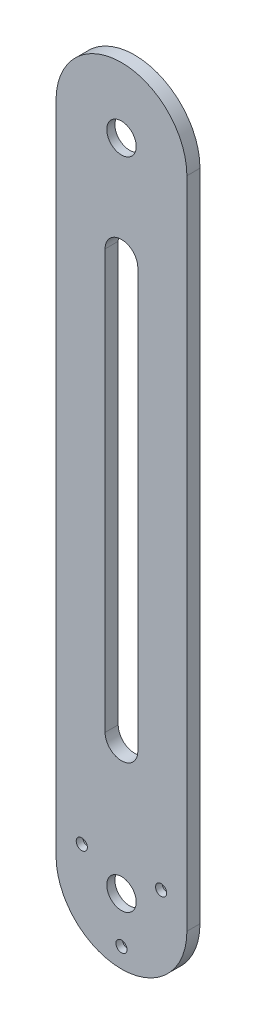
ISO-10303-21;
HEADER;
FILE_DESCRIPTION(('STEP AP214'),'2;1');
FILE_NAME('part.step','',(''),(''),'','','');
FILE_SCHEMA(('AUTOMOTIVE_DESIGN { 1 0 10303 214 1 1 1 1 }'));
ENDSEC;
DATA;
#1=APPLICATION_CONTEXT('core data for automotive mechanical design processes');
#2=APPLICATION_PROTOCOL_DEFINITION('international standard','automotive_design',2000,#1);
#3=PRODUCT_CONTEXT('',#1,'mechanical');
#4=PRODUCT('Part','Part','',(#3));
#5=PRODUCT_RELATED_PRODUCT_CATEGORY('part','',(#4));
#6=PRODUCT_DEFINITION_FORMATION('','',#4);
#7=PRODUCT_DEFINITION_CONTEXT('part definition',#1,'design');
#8=PRODUCT_DEFINITION('design','',#6,#7);
#9=PRODUCT_DEFINITION_SHAPE('','',#8);
#10=(LENGTH_UNIT() NAMED_UNIT(*) SI_UNIT(.MILLI.,.METRE.));
#11=(NAMED_UNIT(*) PLANE_ANGLE_UNIT() SI_UNIT($,.RADIAN.));
#12=(NAMED_UNIT(*) SI_UNIT($,.STERADIAN.) SOLID_ANGLE_UNIT());
#13=UNCERTAINTY_MEASURE_WITH_UNIT(LENGTH_MEASURE(1.E-05),#10,'distance_accuracy_value','');
#14=(GEOMETRIC_REPRESENTATION_CONTEXT(3) GLOBAL_UNCERTAINTY_ASSIGNED_CONTEXT((#13)) GLOBAL_UNIT_ASSIGNED_CONTEXT((#10,
#11,#12)) REPRESENTATION_CONTEXT('',''));
#15=CARTESIAN_POINT('',(0.,0.,0.));
#16=DIRECTION('',(0.,0.,1.));
#17=DIRECTION('',(1.,0.,0.));
#18=AXIS2_PLACEMENT_3D('',#15,#16,#17);
#19=CARTESIAN_POINT('',(-12.1243556529821,-193.,4.));
#20=DIRECTION('',(0.,0.,-1.));
#21=DIRECTION('',(-1.,0.,0.));
#22=AXIS2_PLACEMENT_3D('',#19,#20,#21);
#23=CYLINDRICAL_SURFACE('',#22,1.69999999999996);
#24=CARTESIAN_POINT('',(-12.1243556529821,-193.,4.));
#25=DIRECTION('',(0.,0.,-1.));
#26=DIRECTION('',(-1.,0.,0.));
#27=AXIS2_PLACEMENT_3D('',#24,#25,#26);
#28=CIRCLE('',#27,1.69999999999996);
#29=CARTESIAN_POINT('',(-13.824355652982,-193.,4.));
#30=VERTEX_POINT('',#29);
#31=EDGE_CURVE('E129',#30,#30,#28,.T.);
#32=ORIENTED_EDGE('',*,*,#31,.F.);
#33=EDGE_LOOP('',(#32));
#34=FACE_BOUND('',#33,.T.);
#35=CARTESIAN_POINT('',(-12.1243556529821,-193.,2.));
#36=DIRECTION('',(0.,0.,-1.));
#37=DIRECTION('',(-1.,0.,0.));
#38=AXIS2_PLACEMENT_3D('',#35,#36,#37);
#39=CIRCLE('',#38,1.69999999999996);
#40=CARTESIAN_POINT('',(-13.824355652982,-193.,2.));
#41=VERTEX_POINT('',#40);
#42=EDGE_CURVE('E42',#41,#41,#39,.F.);
#43=ORIENTED_EDGE('',*,*,#42,.F.);
#44=EDGE_LOOP('',(#43));
#45=FACE_BOUND('',#44,.T.);
#46=ADVANCED_FACE('F38',(#34,#45),#23,.F.);
#47=CARTESIAN_POINT('',(12.124355652982,-193.,4.));
#48=DIRECTION('',(0.,0.,-1.));
#49=DIRECTION('',(-1.,0.,0.));
#50=AXIS2_PLACEMENT_3D('',#47,#48,#49);
#51=CYLINDRICAL_SURFACE('',#50,1.69999999999973);
#52=CARTESIAN_POINT('',(12.124355652982,-193.,4.));
#53=DIRECTION('',(0.,0.,-1.));
#54=DIRECTION('',(-1.,0.,0.));
#55=AXIS2_PLACEMENT_3D('',#52,#53,#54);
#56=CIRCLE('',#55,1.69999999999973);
#57=CARTESIAN_POINT('',(10.4243556529823,-193.,4.));
#58=VERTEX_POINT('',#57);
#59=EDGE_CURVE('E206',#58,#58,#56,.T.);
#60=ORIENTED_EDGE('',*,*,#59,.F.);
#61=EDGE_LOOP('',(#60));
#62=FACE_BOUND('',#61,.T.);
#63=CARTESIAN_POINT('',(12.124355652982,-193.,2.));
#64=DIRECTION('',(0.,0.,-1.));
#65=DIRECTION('',(-1.,0.,0.));
#66=AXIS2_PLACEMENT_3D('',#63,#64,#65);
#67=CIRCLE('',#66,1.69999999999973);
#68=CARTESIAN_POINT('',(10.4243556529823,-193.,2.));
#69=VERTEX_POINT('',#68);
#70=EDGE_CURVE('E197',#69,#69,#67,.F.);
#71=ORIENTED_EDGE('',*,*,#70,.F.);
#72=EDGE_LOOP('',(#71));
#73=FACE_BOUND('',#72,.T.);
#74=ADVANCED_FACE('F265',(#62,#73),#51,.F.);
#75=CARTESIAN_POINT('',(0.,-214.,4.));
#76=DIRECTION('',(0.,0.,-1.));
#77=DIRECTION('',(-1.,0.,0.));
#78=AXIS2_PLACEMENT_3D('',#75,#76,#77);
#79=CYLINDRICAL_SURFACE('',#78,1.7);
#80=CARTESIAN_POINT('',(0.,-214.,4.));
#81=DIRECTION('',(0.,0.,-1.));
#82=DIRECTION('',(-1.,0.,0.));
#83=AXIS2_PLACEMENT_3D('',#80,#81,#82);
#84=CIRCLE('',#83,1.7);
#85=CARTESIAN_POINT('',(-1.69999999999997,-214.,4.));
#86=VERTEX_POINT('',#85);
#87=EDGE_CURVE('E136',#86,#86,#84,.T.);
#88=ORIENTED_EDGE('',*,*,#87,.F.);
#89=EDGE_LOOP('',(#88));
#90=FACE_BOUND('',#89,.T.);
#91=CARTESIAN_POINT('',(0.,-214.,2.));
#92=DIRECTION('',(0.,0.,-1.));
#93=DIRECTION('',(-1.,0.,0.));
#94=AXIS2_PLACEMENT_3D('',#91,#92,#93);
#95=CIRCLE('',#94,1.7);
#96=CARTESIAN_POINT('',(-1.69999999999997,-214.,2.));
#97=VERTEX_POINT('',#96);
#98=EDGE_CURVE('E195',#97,#97,#95,.F.);
#99=ORIENTED_EDGE('',*,*,#98,.F.);
#100=EDGE_LOOP('',(#99));
#101=FACE_BOUND('',#100,.T.);
#102=ADVANCED_FACE('F271',(#90,#101),#79,.F.);
#103=CARTESIAN_POINT('',(0.,-200.,4.));
#104=DIRECTION('',(0.,0.,-1.));
#105=DIRECTION('',(-1.,0.,0.));
#106=AXIS2_PLACEMENT_3D('',#103,#104,#105);
#107=CYLINDRICAL_SURFACE('',#106,8.75000000000004);
#108=CARTESIAN_POINT('',(0.,-200.,0.));
#109=DIRECTION('',(0.,0.,1.));
#110=DIRECTION('',(1.,0.,0.));
#111=AXIS2_PLACEMENT_3D('',#108,#109,#110);
#112=CIRCLE('',#111,8.75000000000004);
#113=CARTESIAN_POINT('',(8.75000000000006,-200.,0.));
#114=VERTEX_POINT('',#113);
#115=EDGE_CURVE('E163',#114,#114,#112,.T.);
#116=ORIENTED_EDGE('',*,*,#115,.F.);
#117=EDGE_LOOP('',(#116));
#118=FACE_BOUND('',#117,.T.);
#119=CARTESIAN_POINT('',(0.,-200.,1.5));
#120=DIRECTION('',(0.,0.,1.));
#121=DIRECTION('',(1.,0.,0.));
#122=AXIS2_PLACEMENT_3D('',#119,#120,#121);
#123=CIRCLE('',#122,8.75000000000004);
#124=CARTESIAN_POINT('',(8.75000000000006,-200.,1.5));
#125=VERTEX_POINT('',#124);
#126=EDGE_CURVE('E149',#125,#125,#123,.T.);
#127=ORIENTED_EDGE('',*,*,#126,.T.);
#128=EDGE_LOOP('',(#127));
#129=FACE_BOUND('',#128,.T.);
#130=ADVANCED_FACE('F304',(#118,#129),#107,.F.);
#131=CARTESIAN_POINT('',(0.,0.,4.));
#132=DIRECTION('',(0.,0.,-1.));
#133=DIRECTION('',(-1.,0.,0.));
#134=AXIS2_PLACEMENT_3D('',#131,#132,#133);
#135=CYLINDRICAL_SURFACE('',#134,8.75);
#136=CARTESIAN_POINT('',(0.,0.,0.));
#137=DIRECTION('',(0.,0.,1.));
#138=DIRECTION('',(1.,0.,0.));
#139=AXIS2_PLACEMENT_3D('',#136,#137,#138);
#140=CIRCLE('',#139,8.75);
#141=CARTESIAN_POINT('',(8.75,0.,0.));
#142=VERTEX_POINT('',#141);
#143=EDGE_CURVE('E166',#142,#142,#140,.T.);
#144=ORIENTED_EDGE('',*,*,#143,.F.);
#145=EDGE_LOOP('',(#144));
#146=FACE_BOUND('',#145,.T.);
#147=CARTESIAN_POINT('',(0.,0.,1.5));
#148=DIRECTION('',(0.,0.,1.));
#149=DIRECTION('',(1.,0.,0.));
#150=AXIS2_PLACEMENT_3D('',#147,#148,#149);
#151=CIRCLE('',#150,8.75);
#152=CARTESIAN_POINT('',(8.75,0.,1.5));
#153=VERTEX_POINT('',#152);
#154=EDGE_CURVE('E158',#153,#153,#151,.T.);
#155=ORIENTED_EDGE('',*,*,#154,.T.);
#156=EDGE_LOOP('',(#155));
#157=FACE_BOUND('',#156,.T.);
#158=ADVANCED_FACE('F307',(#146,#157),#135,.F.);
#159=CARTESIAN_POINT('',(0.,-200.,4.));
#160=DIRECTION('',(0.,0.,1.));
#161=DIRECTION('',(1.,0.,0.));
#162=AXIS2_PLACEMENT_3D('',#159,#160,#161);
#163=PLANE('',#162);
#164=ORIENTED_EDGE('',*,*,#87,.T.);
#165=EDGE_LOOP('',(#164));
#166=FACE_BOUND('',#165,.T.);
#167=ORIENTED_EDGE('',*,*,#59,.T.);
#168=EDGE_LOOP('',(#167));
#169=FACE_BOUND('',#168,.T.);
#170=ORIENTED_EDGE('',*,*,#31,.T.);
#171=EDGE_LOOP('',(#170));
#172=FACE_BOUND('',#171,.T.);
#173=CARTESIAN_POINT('',(0.,-31.8450046889655,4.));
#174=DIRECTION('',(0.,0.,1.));
#175=DIRECTION('',(-1.,0.,0.));
#176=AXIS2_PLACEMENT_3D('',#173,#174,#175);
#177=CIRCLE('',#176,5.00000000000001);
#178=CARTESIAN_POINT('',(5.00000000000002,-31.8450046889655,4.));
#179=VERTEX_POINT('',#178);
#180=CARTESIAN_POINT('',(-5.,-31.8450046889655,4.));
#181=VERTEX_POINT('',#180);
#182=EDGE_CURVE('E55',#179,#181,#177,.T.);
#183=ORIENTED_EDGE('',*,*,#182,.F.);
#184=DIRECTION('',(0.,1.,0.));
#185=VECTOR('',#184,1.);
#186=CARTESIAN_POINT('',(5.00000000000002,-159.845004688965,4.));
#187=LINE('',#186,#185);
#188=CARTESIAN_POINT('',(5.00000000000002,-159.845004688965,4.));
#189=VERTEX_POINT('',#188);
#190=EDGE_CURVE('E123',#189,#179,#187,.T.);
#191=ORIENTED_EDGE('',*,*,#190,.F.);
#192=CARTESIAN_POINT('',(0.,-159.845004688965,4.));
#193=DIRECTION('',(0.,0.,1.));
#194=DIRECTION('',(1.,0.,0.));
#195=AXIS2_PLACEMENT_3D('',#192,#193,#194);
#196=CIRCLE('',#195,5.);
#197=CARTESIAN_POINT('',(-4.99999999999998,-159.845004688965,4.));
#198=VERTEX_POINT('',#197);
#199=EDGE_CURVE('E126',#198,#189,#196,.T.);
#200=ORIENTED_EDGE('',*,*,#199,.F.);
#201=DIRECTION('',(0.,-1.,0.));
#202=VECTOR('',#201,1.);
#203=CARTESIAN_POINT('',(-5.,-31.8450046889655,4.));
#204=LINE('',#203,#202);
#205=EDGE_CURVE('E135',#181,#198,#204,.T.);
#206=ORIENTED_EDGE('',*,*,#205,.F.);
#207=EDGE_LOOP('',(#183,#191,#200,#206));
#208=FACE_BOUND('',#207,.T.);
#209=CARTESIAN_POINT('',(0.,-200.,4.));
#210=DIRECTION('',(0.,0.,1.));
#211=DIRECTION('',(1.,0.,0.));
#212=AXIS2_PLACEMENT_3D('',#209,#210,#211);
#213=CIRCLE('',#212,20.);
#214=CARTESIAN_POINT('',(-20.,-200.,4.));
#215=VERTEX_POINT('',#214);
#216=CARTESIAN_POINT('',(20.,-200.,4.));
#217=VERTEX_POINT('',#216);
#218=EDGE_CURVE('E170',#215,#217,#213,.T.);
#219=ORIENTED_EDGE('',*,*,#218,.T.);
#220=DIRECTION('',(0.,1.,0.));
#221=VECTOR('',#220,1.);
#222=CARTESIAN_POINT('',(20.,-200.,4.));
#223=LINE('',#222,#221);
#224=CARTESIAN_POINT('',(20.,0.,4.));
#225=VERTEX_POINT('',#224);
#226=EDGE_CURVE('E173',#217,#225,#223,.T.);
#227=ORIENTED_EDGE('',*,*,#226,.T.);
#228=CARTESIAN_POINT('',(0.,0.,4.));
#229=DIRECTION('',(0.,0.,1.));
#230=DIRECTION('',(1.,0.,0.));
#231=AXIS2_PLACEMENT_3D('',#228,#229,#230);
#232=CIRCLE('',#231,20.);
#233=CARTESIAN_POINT('',(-20.,0.,4.));
#234=VERTEX_POINT('',#233);
#235=EDGE_CURVE('E176',#225,#234,#232,.T.);
#236=ORIENTED_EDGE('',*,*,#235,.T.);
#237=DIRECTION('',(0.,-1.,0.));
#238=VECTOR('',#237,1.);
#239=CARTESIAN_POINT('',(-20.,0.,4.));
#240=LINE('',#239,#238);
#241=EDGE_CURVE('E178',#234,#215,#240,.T.);
#242=ORIENTED_EDGE('',*,*,#241,.T.);
#243=EDGE_LOOP('',(#219,#227,#236,#242));
#244=FACE_BOUND('',#243,.T.);
#245=CARTESIAN_POINT('',(0.,0.,4.));
#246=DIRECTION('',(0.,0.,1.));
#247=DIRECTION('',(1.,0.,0.));
#248=AXIS2_PLACEMENT_3D('',#245,#246,#247);
#249=CIRCLE('',#248,4.5);
#250=CARTESIAN_POINT('',(4.5,0.,4.));
#251=VERTEX_POINT('',#250);
#252=EDGE_CURVE('E154',#251,#251,#249,.T.);
#253=ORIENTED_EDGE('',*,*,#252,.F.);
#254=EDGE_LOOP('',(#253));
#255=FACE_BOUND('',#254,.T.);
#256=CARTESIAN_POINT('',(0.,-200.,4.));
#257=DIRECTION('',(0.,0.,1.));
#258=DIRECTION('',(1.,0.,0.));
#259=AXIS2_PLACEMENT_3D('',#256,#257,#258);
#260=CIRCLE('',#259,4.49999999999999);
#261=CARTESIAN_POINT('',(4.50000000000002,-200.,4.));
#262=VERTEX_POINT('',#261);
#263=EDGE_CURVE('E142',#262,#262,#260,.T.);
#264=ORIENTED_EDGE('',*,*,#263,.F.);
#265=EDGE_LOOP('',(#264));
#266=FACE_BOUND('',#265,.T.);
#267=ADVANCED_FACE('F244',(#166,#169,#172,#208,#244,#255,#266),#163,.T.);
#268=CARTESIAN_POINT('',(0.,-200.,0.));
#269=DIRECTION('',(0.,0.,1.));
#270=DIRECTION('',(1.,0.,0.));
#271=AXIS2_PLACEMENT_3D('',#268,#269,#270);
#272=PLANE('',#271);
#273=CARTESIAN_POINT('',(12.124355652982,-193.,0.));
#274=DIRECTION('',(0.,0.,-1.));
#275=DIRECTION('',(-1.,0.,0.));
#276=AXIS2_PLACEMENT_3D('',#273,#274,#275);
#277=CIRCLE('',#276,3.00000000000001);
#278=CARTESIAN_POINT('',(9.12435565298204,-193.,0.));
#279=VERTEX_POINT('',#278);
#280=EDGE_CURVE('E227',#279,#279,#277,.T.);
#281=ORIENTED_EDGE('',*,*,#280,.F.);
#282=EDGE_LOOP('',(#281));
#283=FACE_BOUND('',#282,.T.);
#284=CARTESIAN_POINT('',(-12.1243556529821,-193.,0.));
#285=DIRECTION('',(0.,0.,-1.));
#286=DIRECTION('',(-1.,0.,0.));
#287=AXIS2_PLACEMENT_3D('',#284,#285,#286);
#288=CIRCLE('',#287,3.);
#289=CARTESIAN_POINT('',(-15.1243556529821,-193.,0.));
#290=VERTEX_POINT('',#289);
#291=EDGE_CURVE('E221',#290,#290,#288,.T.);
#292=ORIENTED_EDGE('',*,*,#291,.F.);
#293=EDGE_LOOP('',(#292));
#294=FACE_BOUND('',#293,.T.);
#295=CARTESIAN_POINT('',(0.,-214.,0.));
#296=DIRECTION('',(0.,0.,-1.));
#297=DIRECTION('',(-1.,0.,0.));
#298=AXIS2_PLACEMENT_3D('',#295,#296,#297);
#299=CIRCLE('',#298,3.);
#300=CARTESIAN_POINT('',(-2.99999999999997,-214.,0.));
#301=VERTEX_POINT('',#300);
#302=EDGE_CURVE('E215',#301,#301,#299,.T.);
#303=ORIENTED_EDGE('',*,*,#302,.F.);
#304=EDGE_LOOP('',(#303));
#305=FACE_BOUND('',#304,.T.);
#306=DIRECTION('',(0.,1.,0.));
#307=VECTOR('',#306,1.);
#308=CARTESIAN_POINT('',(5.00000000000002,-159.845004688965,0.));
#309=LINE('',#308,#307);
#310=CARTESIAN_POINT('',(5.00000000000002,-159.845004688965,0.));
#311=VERTEX_POINT('',#310);
#312=CARTESIAN_POINT('',(5.00000000000002,-31.8450046889655,0.));
#313=VERTEX_POINT('',#312);
#314=EDGE_CURVE('E113',#311,#313,#309,.T.);
#315=ORIENTED_EDGE('',*,*,#314,.T.);
#316=CARTESIAN_POINT('',(0.,-31.8450046889655,0.));
#317=DIRECTION('',(0.,0.,1.));
#318=DIRECTION('',(-1.,0.,0.));
#319=AXIS2_PLACEMENT_3D('',#316,#317,#318);
#320=CIRCLE('',#319,5.00000000000001);
#321=CARTESIAN_POINT('',(-5.,-31.8450046889655,0.));
#322=VERTEX_POINT('',#321);
#323=EDGE_CURVE('E107',#313,#322,#320,.T.);
#324=ORIENTED_EDGE('',*,*,#323,.T.);
#325=DIRECTION('',(0.,-1.,0.));
#326=VECTOR('',#325,1.);
#327=CARTESIAN_POINT('',(-5.,-31.8450046889655,0.));
#328=LINE('',#327,#326);
#329=CARTESIAN_POINT('',(-4.99999999999998,-159.845004688965,0.));
#330=VERTEX_POINT('',#329);
#331=EDGE_CURVE('E116',#322,#330,#328,.T.);
#332=ORIENTED_EDGE('',*,*,#331,.T.);
#333=CARTESIAN_POINT('',(0.,-159.845004688965,0.));
#334=DIRECTION('',(0.,0.,1.));
#335=DIRECTION('',(1.,0.,0.));
#336=AXIS2_PLACEMENT_3D('',#333,#334,#335);
#337=CIRCLE('',#336,5.);
#338=EDGE_CURVE('E63',#330,#311,#337,.T.);
#339=ORIENTED_EDGE('',*,*,#338,.T.);
#340=EDGE_LOOP('',(#315,#324,#332,#339));
#341=FACE_BOUND('',#340,.T.);
#342=CARTESIAN_POINT('',(0.,-200.,0.));
#343=DIRECTION('',(0.,0.,1.));
#344=DIRECTION('',(1.,0.,0.));
#345=AXIS2_PLACEMENT_3D('',#342,#343,#344);
#346=CIRCLE('',#345,20.);
#347=CARTESIAN_POINT('',(-20.,-200.,0.));
#348=VERTEX_POINT('',#347);
#349=CARTESIAN_POINT('',(20.,-200.,0.));
#350=VERTEX_POINT('',#349);
#351=EDGE_CURVE('E169',#348,#350,#346,.T.);
#352=ORIENTED_EDGE('',*,*,#351,.F.);
#353=DIRECTION('',(0.,-1.,0.));
#354=VECTOR('',#353,1.);
#355=CARTESIAN_POINT('',(-20.,0.,0.));
#356=LINE('',#355,#354);
#357=CARTESIAN_POINT('',(-20.,0.,0.));
#358=VERTEX_POINT('',#357);
#359=EDGE_CURVE('E174',#358,#348,#356,.T.);
#360=ORIENTED_EDGE('',*,*,#359,.F.);
#361=CARTESIAN_POINT('',(0.,0.,0.));
#362=DIRECTION('',(0.,0.,1.));
#363=DIRECTION('',(1.,0.,0.));
#364=AXIS2_PLACEMENT_3D('',#361,#362,#363);
#365=CIRCLE('',#364,20.);
#366=CARTESIAN_POINT('',(20.,0.,0.));
#367=VERTEX_POINT('',#366);
#368=EDGE_CURVE('E185',#367,#358,#365,.T.);
#369=ORIENTED_EDGE('',*,*,#368,.F.);
#370=DIRECTION('',(0.,1.,0.));
#371=VECTOR('',#370,1.);
#372=CARTESIAN_POINT('',(20.,-200.,0.));
#373=LINE('',#372,#371);
#374=EDGE_CURVE('E183',#350,#367,#373,.T.);
#375=ORIENTED_EDGE('',*,*,#374,.F.);
#376=EDGE_LOOP('',(#352,#360,#369,#375));
#377=FACE_BOUND('',#376,.T.);
#378=ORIENTED_EDGE('',*,*,#143,.T.);
#379=EDGE_LOOP('',(#378));
#380=FACE_BOUND('',#379,.T.);
#381=ORIENTED_EDGE('',*,*,#115,.T.);
#382=EDGE_LOOP('',(#381));
#383=FACE_BOUND('',#382,.T.);
#384=ADVANCED_FACE('F120',(#283,#294,#305,#341,#377,#380,#383),#272,.F.);
#385=CARTESIAN_POINT('',(0.,-200.,4.));
#386=DIRECTION('',(0.,0.,-1.));
#387=DIRECTION('',(-1.,0.,0.));
#388=AXIS2_PLACEMENT_3D('',#385,#386,#387);
#389=CYLINDRICAL_SURFACE('',#388,20.);
#390=ORIENTED_EDGE('',*,*,#351,.T.);
#391=DIRECTION('',(0.,0.,-1.));
#392=VECTOR('',#391,1.);
#393=CARTESIAN_POINT('',(20.,-200.,4.));
#394=LINE('',#393,#392);
#395=EDGE_CURVE('E11',#217,#350,#394,.T.);
#396=ORIENTED_EDGE('',*,*,#395,.F.);
#397=ORIENTED_EDGE('',*,*,#218,.F.);
#398=DIRECTION('',(0.,0.,-1.));
#399=VECTOR('',#398,1.);
#400=CARTESIAN_POINT('',(-20.,-200.,4.));
#401=LINE('',#400,#399);
#402=EDGE_CURVE('E180',#215,#348,#401,.T.);
#403=ORIENTED_EDGE('',*,*,#402,.T.);
#404=EDGE_LOOP('',(#390,#396,#397,#403));
#405=FACE_BOUND('',#404,.T.);
#406=ADVANCED_FACE('F40',(#405),#389,.T.);
#407=CARTESIAN_POINT('',(20.,-200.,4.));
#408=DIRECTION('',(-1.,0.,0.));
#409=DIRECTION('',(0.,-1.,0.));
#410=AXIS2_PLACEMENT_3D('',#407,#408,#409);
#411=PLANE('',#410);
#412=ORIENTED_EDGE('',*,*,#374,.T.);
#413=DIRECTION('',(0.,0.,-1.));
#414=VECTOR('',#413,1.);
#415=CARTESIAN_POINT('',(20.,0.,4.));
#416=LINE('',#415,#414);
#417=EDGE_CURVE('E47',#225,#367,#416,.T.);
#418=ORIENTED_EDGE('',*,*,#417,.F.);
#419=ORIENTED_EDGE('',*,*,#226,.F.);
#420=ORIENTED_EDGE('',*,*,#395,.T.);
#421=EDGE_LOOP('',(#412,#418,#419,#420));
#422=FACE_BOUND('',#421,.T.);
#423=ADVANCED_FACE('F320',(#422),#411,.F.);
#424=CARTESIAN_POINT('',(0.,0.,4.));
#425=DIRECTION('',(0.,0.,-1.));
#426=DIRECTION('',(-1.,0.,0.));
#427=AXIS2_PLACEMENT_3D('',#424,#425,#426);
#428=CYLINDRICAL_SURFACE('',#427,20.);
#429=ORIENTED_EDGE('',*,*,#368,.T.);
#430=DIRECTION('',(0.,0.,-1.));
#431=VECTOR('',#430,1.);
#432=CARTESIAN_POINT('',(-20.,0.,4.));
#433=LINE('',#432,#431);
#434=EDGE_CURVE('E190',#234,#358,#433,.T.);
#435=ORIENTED_EDGE('',*,*,#434,.F.);
#436=ORIENTED_EDGE('',*,*,#235,.F.);
#437=ORIENTED_EDGE('',*,*,#417,.T.);
#438=EDGE_LOOP('',(#429,#435,#436,#437));
#439=FACE_BOUND('',#438,.T.);
#440=ADVANCED_FACE('F317',(#439),#428,.T.);
#441=CARTESIAN_POINT('',(-20.,0.,4.));
#442=DIRECTION('',(1.,0.,0.));
#443=DIRECTION('',(0.,1.,0.));
#444=AXIS2_PLACEMENT_3D('',#441,#442,#443);
#445=PLANE('',#444);
#446=ORIENTED_EDGE('',*,*,#359,.T.);
#447=ORIENTED_EDGE('',*,*,#402,.F.);
#448=ORIENTED_EDGE('',*,*,#241,.F.);
#449=ORIENTED_EDGE('',*,*,#434,.T.);
#450=EDGE_LOOP('',(#446,#447,#448,#449));
#451=FACE_BOUND('',#450,.T.);
#452=ADVANCED_FACE('F302',(#451),#445,.F.);
#453=CARTESIAN_POINT('',(0.,0.,1.5));
#454=DIRECTION('',(0.,0.,1.));
#455=DIRECTION('',(1.,0.,0.));
#456=AXIS2_PLACEMENT_3D('',#453,#454,#455);
#457=PLANE('',#456);
#458=CARTESIAN_POINT('',(0.,0.,1.5));
#459=DIRECTION('',(0.,0.,1.));
#460=DIRECTION('',(1.,0.,0.));
#461=AXIS2_PLACEMENT_3D('',#458,#459,#460);
#462=CIRCLE('',#461,4.5);
#463=CARTESIAN_POINT('',(4.5,0.,1.5));
#464=VERTEX_POINT('',#463);
#465=EDGE_CURVE('E155',#464,#464,#462,.T.);
#466=ORIENTED_EDGE('',*,*,#465,.T.);
#467=EDGE_LOOP('',(#466));
#468=FACE_BOUND('',#467,.T.);
#469=ORIENTED_EDGE('',*,*,#154,.F.);
#470=EDGE_LOOP('',(#469));
#471=FACE_BOUND('',#470,.T.);
#472=ADVANCED_FACE('F298',(#468,#471),#457,.F.);
#473=CARTESIAN_POINT('',(0.,0.,1.5));
#474=DIRECTION('',(0.,0.,1.));
#475=DIRECTION('',(1.,0.,0.));
#476=AXIS2_PLACEMENT_3D('',#473,#474,#475);
#477=CYLINDRICAL_SURFACE('',#476,4.5);
#478=ORIENTED_EDGE('',*,*,#465,.F.);
#479=EDGE_LOOP('',(#478));
#480=FACE_BOUND('',#479,.T.);
#481=ORIENTED_EDGE('',*,*,#252,.T.);
#482=EDGE_LOOP('',(#481));
#483=FACE_BOUND('',#482,.T.);
#484=ADVANCED_FACE('F294',(#480,#483),#477,.F.);
#485=CARTESIAN_POINT('',(0.,-200.,1.5));
#486=DIRECTION('',(0.,0.,1.));
#487=DIRECTION('',(1.,0.,0.));
#488=AXIS2_PLACEMENT_3D('',#485,#486,#487);
#489=PLANE('',#488);
#490=CARTESIAN_POINT('',(0.,-200.,1.5));
#491=DIRECTION('',(0.,0.,1.));
#492=DIRECTION('',(1.,0.,0.));
#493=AXIS2_PLACEMENT_3D('',#490,#491,#492);
#494=CIRCLE('',#493,4.49999999999999);
#495=CARTESIAN_POINT('',(4.50000000000002,-200.,1.5));
#496=VERTEX_POINT('',#495);
#497=EDGE_CURVE('E146',#496,#496,#494,.T.);
#498=ORIENTED_EDGE('',*,*,#497,.T.);
#499=EDGE_LOOP('',(#498));
#500=FACE_BOUND('',#499,.T.);
#501=ORIENTED_EDGE('',*,*,#126,.F.);
#502=EDGE_LOOP('',(#501));
#503=FACE_BOUND('',#502,.T.);
#504=ADVANCED_FACE('F290',(#500,#503),#489,.F.);
#505=CARTESIAN_POINT('',(0.,-200.,1.5));
#506=DIRECTION('',(0.,0.,1.));
#507=DIRECTION('',(1.,0.,0.));
#508=AXIS2_PLACEMENT_3D('',#505,#506,#507);
#509=CYLINDRICAL_SURFACE('',#508,4.49999999999999);
#510=ORIENTED_EDGE('',*,*,#497,.F.);
#511=EDGE_LOOP('',(#510));
#512=FACE_BOUND('',#511,.T.);
#513=ORIENTED_EDGE('',*,*,#263,.T.);
#514=EDGE_LOOP('',(#513));
#515=FACE_BOUND('',#514,.T.);
#516=ADVANCED_FACE('F287',(#512,#515),#509,.F.);
#517=CARTESIAN_POINT('',(0.,-31.8450046889655,0.));
#518=DIRECTION('',(0.,0.,1.));
#519=DIRECTION('',(1.,0.,0.));
#520=AXIS2_PLACEMENT_3D('',#517,#518,#519);
#521=CYLINDRICAL_SURFACE('',#520,5.00000000000001);
#522=ORIENTED_EDGE('',*,*,#182,.T.);
#523=DIRECTION('',(0.,0.,1.));
#524=VECTOR('',#523,1.);
#525=CARTESIAN_POINT('',(-5.,-31.8450046889655,0.));
#526=LINE('',#525,#524);
#527=EDGE_CURVE('E103',#322,#181,#526,.T.);
#528=ORIENTED_EDGE('',*,*,#527,.F.);
#529=ORIENTED_EDGE('',*,*,#323,.F.);
#530=DIRECTION('',(0.,0.,1.));
#531=VECTOR('',#530,1.);
#532=CARTESIAN_POINT('',(5.00000000000002,-31.8450046889655,0.));
#533=LINE('',#532,#531);
#534=EDGE_CURVE('E140',#313,#179,#533,.T.);
#535=ORIENTED_EDGE('',*,*,#534,.T.);
#536=EDGE_LOOP('',(#522,#528,#529,#535));
#537=FACE_BOUND('',#536,.T.);
#538=ADVANCED_FACE('F105',(#537),#521,.F.);
#539=CARTESIAN_POINT('',(5.00000000000002,-159.845004688965,0.));
#540=DIRECTION('',(1.,0.,0.));
#541=DIRECTION('',(0.,1.,0.));
#542=AXIS2_PLACEMENT_3D('',#539,#540,#541);
#543=PLANE('',#542);
#544=ORIENTED_EDGE('',*,*,#190,.T.);
#545=ORIENTED_EDGE('',*,*,#534,.F.);
#546=ORIENTED_EDGE('',*,*,#314,.F.);
#547=DIRECTION('',(0.,0.,1.));
#548=VECTOR('',#547,1.);
#549=CARTESIAN_POINT('',(5.00000000000002,-159.845004688965,0.));
#550=LINE('',#549,#548);
#551=EDGE_CURVE('E143',#311,#189,#550,.T.);
#552=ORIENTED_EDGE('',*,*,#551,.T.);
#553=EDGE_LOOP('',(#544,#545,#546,#552));
#554=FACE_BOUND('',#553,.T.);
#555=ADVANCED_FACE('F276',(#554),#543,.F.);
#556=CARTESIAN_POINT('',(0.,-159.845004688965,0.));
#557=DIRECTION('',(0.,0.,1.));
#558=DIRECTION('',(1.,0.,0.));
#559=AXIS2_PLACEMENT_3D('',#556,#557,#558);
#560=CYLINDRICAL_SURFACE('',#559,5.);
#561=ORIENTED_EDGE('',*,*,#199,.T.);
#562=ORIENTED_EDGE('',*,*,#551,.F.);
#563=ORIENTED_EDGE('',*,*,#338,.F.);
#564=DIRECTION('',(0.,0.,1.));
#565=VECTOR('',#564,1.);
#566=CARTESIAN_POINT('',(-4.99999999999998,-159.845004688965,0.));
#567=LINE('',#566,#565);
#568=EDGE_CURVE('E112',#330,#198,#567,.T.);
#569=ORIENTED_EDGE('',*,*,#568,.T.);
#570=EDGE_LOOP('',(#561,#562,#563,#569));
#571=FACE_BOUND('',#570,.T.);
#572=ADVANCED_FACE('F279',(#571),#560,.F.);
#573=CARTESIAN_POINT('',(-5.,-31.8450046889655,0.));
#574=DIRECTION('',(-1.,0.,0.));
#575=DIRECTION('',(0.,-1.,0.));
#576=AXIS2_PLACEMENT_3D('',#573,#574,#575);
#577=PLANE('',#576);
#578=ORIENTED_EDGE('',*,*,#205,.T.);
#579=ORIENTED_EDGE('',*,*,#568,.F.);
#580=ORIENTED_EDGE('',*,*,#331,.F.);
#581=ORIENTED_EDGE('',*,*,#527,.T.);
#582=EDGE_LOOP('',(#578,#579,#580,#581));
#583=FACE_BOUND('',#582,.T.);
#584=ADVANCED_FACE('F117',(#583),#577,.F.);
#585=CARTESIAN_POINT('',(0.,-214.,2.));
#586=DIRECTION('',(0.,0.,-1.));
#587=DIRECTION('',(-1.,0.,0.));
#588=AXIS2_PLACEMENT_3D('',#585,#586,#587);
#589=PLANE('',#588);
#590=CARTESIAN_POINT('',(0.,-214.,2.));
#591=DIRECTION('',(0.,0.,-1.));
#592=DIRECTION('',(-1.,0.,0.));
#593=AXIS2_PLACEMENT_3D('',#590,#591,#592);
#594=CIRCLE('',#593,3.);
#595=CARTESIAN_POINT('',(-2.99999999999997,-214.,2.));
#596=VERTEX_POINT('',#595);
#597=EDGE_CURVE('E218',#596,#596,#594,.T.);
#598=ORIENTED_EDGE('',*,*,#597,.T.);
#599=EDGE_LOOP('',(#598));
#600=FACE_BOUND('',#599,.T.);
#601=ORIENTED_EDGE('',*,*,#98,.T.);
#602=EDGE_LOOP('',(#601));
#603=FACE_BOUND('',#602,.T.);
#604=ADVANCED_FACE('F252',(#600,#603),#589,.T.);
#605=CARTESIAN_POINT('',(0.,-214.,2.));
#606=DIRECTION('',(0.,0.,-1.));
#607=DIRECTION('',(-1.,0.,0.));
#608=AXIS2_PLACEMENT_3D('',#605,#606,#607);
#609=CYLINDRICAL_SURFACE('',#608,3.);
#610=ORIENTED_EDGE('',*,*,#597,.F.);
#611=EDGE_LOOP('',(#610));
#612=FACE_BOUND('',#611,.T.);
#613=ORIENTED_EDGE('',*,*,#302,.T.);
#614=EDGE_LOOP('',(#613));
#615=FACE_BOUND('',#614,.T.);
#616=ADVANCED_FACE('F250',(#612,#615),#609,.F.);
#617=CARTESIAN_POINT('',(12.124355652982,-193.,2.));
#618=DIRECTION('',(0.,0.,-1.));
#619=DIRECTION('',(-1.,0.,0.));
#620=AXIS2_PLACEMENT_3D('',#617,#618,#619);
#621=PLANE('',#620);
#622=CARTESIAN_POINT('',(12.124355652982,-193.,2.));
#623=DIRECTION('',(0.,0.,-1.));
#624=DIRECTION('',(-1.,0.,0.));
#625=AXIS2_PLACEMENT_3D('',#622,#623,#624);
#626=CIRCLE('',#625,3.00000000000001);
#627=CARTESIAN_POINT('',(9.12435565298204,-193.,2.));
#628=VERTEX_POINT('',#627);
#629=EDGE_CURVE('E198',#628,#628,#626,.T.);
#630=ORIENTED_EDGE('',*,*,#629,.T.);
#631=EDGE_LOOP('',(#630));
#632=FACE_BOUND('',#631,.T.);
#633=ORIENTED_EDGE('',*,*,#70,.T.);
#634=EDGE_LOOP('',(#633));
#635=FACE_BOUND('',#634,.T.);
#636=ADVANCED_FACE('F233',(#632,#635),#621,.T.);
#637=CARTESIAN_POINT('',(12.124355652982,-193.,2.));
#638=DIRECTION('',(0.,0.,-1.));
#639=DIRECTION('',(-1.,0.,0.));
#640=AXIS2_PLACEMENT_3D('',#637,#638,#639);
#641=CYLINDRICAL_SURFACE('',#640,3.00000000000001);
#642=ORIENTED_EDGE('',*,*,#629,.F.);
#643=EDGE_LOOP('',(#642));
#644=FACE_BOUND('',#643,.T.);
#645=ORIENTED_EDGE('',*,*,#280,.T.);
#646=EDGE_LOOP('',(#645));
#647=FACE_BOUND('',#646,.T.);
#648=ADVANCED_FACE('F235',(#644,#647),#641,.F.);
#649=CARTESIAN_POINT('',(-12.1243556529821,-193.,2.));
#650=DIRECTION('',(0.,0.,-1.));
#651=DIRECTION('',(-1.,0.,0.));
#652=AXIS2_PLACEMENT_3D('',#649,#650,#651);
#653=PLANE('',#652);
#654=CARTESIAN_POINT('',(-12.1243556529821,-193.,2.));
#655=DIRECTION('',(0.,0.,-1.));
#656=DIRECTION('',(-1.,0.,0.));
#657=AXIS2_PLACEMENT_3D('',#654,#655,#656);
#658=CIRCLE('',#657,3.);
#659=CARTESIAN_POINT('',(-15.1243556529821,-193.,2.));
#660=VERTEX_POINT('',#659);
#661=EDGE_CURVE('E224',#660,#660,#658,.T.);
#662=ORIENTED_EDGE('',*,*,#661,.T.);
#663=EDGE_LOOP('',(#662));
#664=FACE_BOUND('',#663,.T.);
#665=ORIENTED_EDGE('',*,*,#42,.T.);
#666=EDGE_LOOP('',(#665));
#667=FACE_BOUND('',#666,.T.);
#668=ADVANCED_FACE('F238',(#664,#667),#653,.T.);
#669=CARTESIAN_POINT('',(-12.1243556529821,-193.,2.));
#670=DIRECTION('',(0.,0.,-1.));
#671=DIRECTION('',(-1.,0.,0.));
#672=AXIS2_PLACEMENT_3D('',#669,#670,#671);
#673=CYLINDRICAL_SURFACE('',#672,3.);
#674=ORIENTED_EDGE('',*,*,#661,.F.);
#675=EDGE_LOOP('',(#674));
#676=FACE_BOUND('',#675,.T.);
#677=ORIENTED_EDGE('',*,*,#291,.T.);
#678=EDGE_LOOP('',(#677));
#679=FACE_BOUND('',#678,.T.);
#680=ADVANCED_FACE('F419',(#676,#679),#673,.F.);
#681=CLOSED_SHELL('',(#46,#74,#102,#130,#158,#267,#384,#406,#423,#440,#452,#472,#484,#504,#516,
#538,#555,#572,#584,#604,#616,#636,#648,#668,#680));
#682=MANIFOLD_SOLID_BREP('B2',#681);
#683=ADVANCED_BREP_SHAPE_REPRESENTATION('',(#18,#682),#14);
#684=SHAPE_DEFINITION_REPRESENTATION(#9,#683);
ENDSEC;
END-ISO-10303-21;
